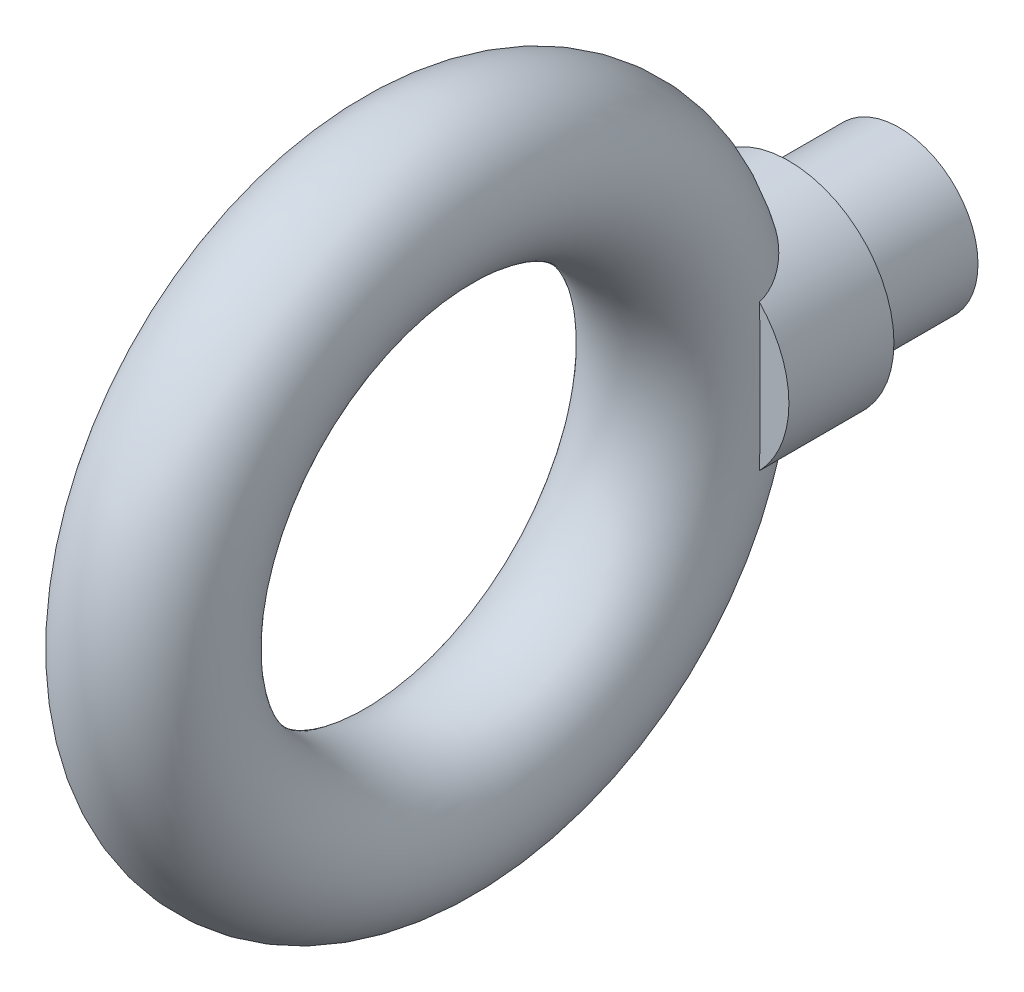
ISO-10303-21;
HEADER;
FILE_DESCRIPTION(('STEP AP214'),'2;1');
FILE_NAME('part.step','',(''),(''),'','','');
FILE_SCHEMA(('AUTOMOTIVE_DESIGN { 1 0 10303 214 1 1 1 1 }'));
ENDSEC;
DATA;
#1=APPLICATION_CONTEXT('core data for automotive mechanical design processes');
#2=APPLICATION_PROTOCOL_DEFINITION('international standard','automotive_design',2000,#1);
#3=PRODUCT_CONTEXT('',#1,'mechanical');
#4=PRODUCT('Part','Part','',(#3));
#5=PRODUCT_RELATED_PRODUCT_CATEGORY('part','',(#4));
#6=PRODUCT_DEFINITION_FORMATION('','',#4);
#7=PRODUCT_DEFINITION_CONTEXT('part definition',#1,'design');
#8=PRODUCT_DEFINITION('design','',#6,#7);
#9=PRODUCT_DEFINITION_SHAPE('','',#8);
#10=(LENGTH_UNIT() NAMED_UNIT(*) SI_UNIT(.MILLI.,.METRE.));
#11=(NAMED_UNIT(*) PLANE_ANGLE_UNIT() SI_UNIT($,.RADIAN.));
#12=(NAMED_UNIT(*) SI_UNIT($,.STERADIAN.) SOLID_ANGLE_UNIT());
#13=UNCERTAINTY_MEASURE_WITH_UNIT(LENGTH_MEASURE(1.E-05),#10,'distance_accuracy_value','');
#14=(GEOMETRIC_REPRESENTATION_CONTEXT(3) GLOBAL_UNCERTAINTY_ASSIGNED_CONTEXT((#13)) GLOBAL_UNIT_ASSIGNED_CONTEXT((#10,
#11,#12)) REPRESENTATION_CONTEXT('',''));
#15=CARTESIAN_POINT('',(0.,0.,0.));
#16=DIRECTION('',(0.,0.,1.));
#17=DIRECTION('',(1.,0.,0.));
#18=AXIS2_PLACEMENT_3D('',#15,#16,#17);
#19=CARTESIAN_POINT('',(0.,0.,8.2));
#20=DIRECTION('',(0.,0.,-1.));
#21=DIRECTION('',(-1.,0.,0.));
#22=AXIS2_PLACEMENT_3D('',#19,#20,#21);
#23=CYLINDRICAL_SURFACE('',#22,3.);
#24=CARTESIAN_POINT('',(0.,0.,0.));
#25=DIRECTION('',(0.,0.,1.));
#26=DIRECTION('',(1.,0.,0.));
#27=AXIS2_PLACEMENT_3D('',#24,#25,#26);
#28=CIRCLE('',#27,3.);
#29=CARTESIAN_POINT('',(3.,0.,0.));
#30=VERTEX_POINT('',#29);
#31=EDGE_CURVE('E66',#30,#30,#28,.T.);
#32=ORIENTED_EDGE('',*,*,#31,.T.);
#33=EDGE_LOOP('',(#32));
#34=FACE_BOUND('',#33,.T.);
#35=CARTESIAN_POINT('',(0.,0.,4.2));
#36=DIRECTION('',(0.,0.,1.));
#37=DIRECTION('',(1.,0.,0.));
#38=AXIS2_PLACEMENT_3D('',#35,#36,#37);
#39=CIRCLE('',#38,3.);
#40=CARTESIAN_POINT('',(3.,0.,4.2));
#41=VERTEX_POINT('',#40);
#42=EDGE_CURVE('E11',#41,#41,#39,.T.);
#43=ORIENTED_EDGE('',*,*,#42,.F.);
#44=EDGE_LOOP('',(#43));
#45=FACE_BOUND('',#44,.T.);
#46=ADVANCED_FACE('F36',(#34,#45),#23,.T.);
#47=CARTESIAN_POINT('',(0.,0.,0.));
#48=DIRECTION('',(0.,0.,1.));
#49=DIRECTION('',(1.,0.,0.));
#50=AXIS2_PLACEMENT_3D('',#47,#48,#49);
#51=PLANE('',#50);
#52=ORIENTED_EDGE('',*,*,#31,.F.);
#53=EDGE_LOOP('',(#52));
#54=FACE_BOUND('',#53,.T.);
#55=ADVANCED_FACE('F104',(#54),#51,.F.);
#56=CARTESIAN_POINT('',(0.,0.,4.2));
#57=DIRECTION('',(0.,0.,1.));
#58=DIRECTION('',(1.,0.,0.));
#59=AXIS2_PLACEMENT_3D('',#56,#57,#58);
#60=PLANE('',#59);
#61=CARTESIAN_POINT('',(0.,0.,4.2));
#62=DIRECTION('',(0.,0.,1.));
#63=DIRECTION('',(1.,0.,0.));
#64=AXIS2_PLACEMENT_3D('',#61,#62,#63);
#65=CIRCLE('',#64,4.);
#66=CARTESIAN_POINT('',(4.,0.,4.2));
#67=VERTEX_POINT('',#66);
#68=EDGE_CURVE('E75',#67,#67,#65,.T.);
#69=ORIENTED_EDGE('',*,*,#68,.F.);
#70=EDGE_LOOP('',(#69));
#71=FACE_BOUND('',#70,.T.);
#72=ORIENTED_EDGE('',*,*,#42,.T.);
#73=EDGE_LOOP('',(#72));
#74=FACE_BOUND('',#73,.T.);
#75=ADVANCED_FACE('F100',(#71,#74),#60,.F.);
#76=CARTESIAN_POINT('',(0.,0.,4.2));
#77=DIRECTION('',(0.,0.,1.));
#78=DIRECTION('',(1.,0.,0.));
#79=AXIS2_PLACEMENT_3D('',#76,#77,#78);
#80=CYLINDRICAL_SURFACE('',#79,4.);
#81=ORIENTED_EDGE('',*,*,#68,.T.);
#82=EDGE_LOOP('',(#81));
#83=FACE_BOUND('',#82,.T.);
#84=CARTESIAN_POINT('',(2.87558129313584,2.78047338174045,8.20020000000001));
#85=CARTESIAN_POINT('',(2.8668163331566,2.78951972189364,8.13290860941364));
#86=CARTESIAN_POINT('',(2.8556063579357,2.8010460765121,8.06630078863233));
#87=CARTESIAN_POINT('',(2.82842675937782,2.82849808273465,7.93509479380524));
#88=CARTESIAN_POINT('',(2.81246435956833,2.84441705503725,7.87049373295381));
#89=CARTESIAN_POINT('',(2.77605947415572,2.87995204819738,7.74434807725299));
#90=CARTESIAN_POINT('',(2.75566167117051,2.89953094078722,7.68278001718187));
#91=CARTESIAN_POINT('',(2.71050143019162,2.94179262248841,7.56237139912809));
#92=CARTESIAN_POINT('',(2.68573751491093,2.96447646158476,7.50353177285676));
#93=CARTESIAN_POINT('',(2.6055241740768,3.0358384568672,7.33211997232601));
#94=CARTESIAN_POINT('',(2.54391559930227,3.08807179719291,7.22384452475566));
#95=CARTESIAN_POINT('',(2.40577757786088,3.19687351620991,7.01944232342703));
#96=CARTESIAN_POINT('',(2.32920706513163,3.25345355987673,6.92335023421617));
#97=CARTESIAN_POINT('',(2.15114340221079,3.37426419820854,6.731369281726));
#98=CARTESIAN_POINT('',(2.04767492476977,3.4384847472684,6.63729901922333));
#99=CARTESIAN_POINT('',(1.82512446378997,3.56161702993713,6.46568214038757));
#100=CARTESIAN_POINT('',(1.7060440591267,3.62052929937116,6.38813385522229));
#101=CARTESIAN_POINT('',(1.44085407485933,3.7345530657047,6.24287429039681));
#102=CARTESIAN_POINT('',(1.29321690947494,3.78859526738382,6.17708428315477));
#103=CARTESIAN_POINT('',(0.985047984966199,3.88014055303585,6.06791934780051));
#104=CARTESIAN_POINT('',(0.824519711095935,3.91764808966092,6.02453838457197));
#105=CARTESIAN_POINT('',(0.505300401221189,3.97105742028187,5.9633054298052));
#106=CARTESIAN_POINT('',(0.347062909683602,3.98810653898653,5.94409449620717));
#107=CARTESIAN_POINT('',(0.0285683994185187,4.00306991623282,5.9272162880416));
#108=CARTESIAN_POINT('',(-0.131687873094603,4.00099104925576,5.92954127359816));
#109=CARTESIAN_POINT('',(-0.439569995074033,3.97859226174756,5.95485659673338));
#110=CARTESIAN_POINT('',(-0.587380756896093,3.95936288581058,5.97661155899829));
#111=CARTESIAN_POINT('',(-0.876180449814498,3.90562208521733,6.03849067206565));
#112=CARTESIAN_POINT('',(-1.01716956039897,3.87111106288748,6.07861433926831));
#113=CARTESIAN_POINT('',(-1.2919261620332,3.78839850475261,6.17740084298226));
#114=CARTESIAN_POINT('',(-1.42546928374572,3.73991497660207,6.23644868257861));
#115=CARTESIAN_POINT('',(-1.67923126303157,3.63306505491525,6.37183999308199));
#116=CARTESIAN_POINT('',(-1.79944044966835,3.57469156486929,6.44819589672201));
#117=CARTESIAN_POINT('',(-2.03313154020781,3.44752244393446,6.62405865321118));
#118=CARTESIAN_POINT('',(-2.14535578410649,3.37826894906249,6.72490742691012));
#119=CARTESIAN_POINT('',(-2.3495039764539,3.23960349921638,6.94545882215044));
#120=CARTESIAN_POINT('',(-2.44143148475907,3.17019157419052,7.06515813116559));
#121=CARTESIAN_POINT('',(-2.5852179973545,3.05341384380939,7.29546935832888));
#122=CARTESIAN_POINT('',(-2.64144120151746,3.00450366070358,7.40257348834003));
#123=CARTESIAN_POINT('',(-2.73808766823659,2.91670137098883,7.62727687025745));
#124=CARTESIAN_POINT('',(-2.77856547527022,2.877774842079,7.74483812580717));
#125=CARTESIAN_POINT('',(-2.82476422528207,2.83215623570087,7.92062328765685));
#126=CARTESIAN_POINT('',(-2.83731387696423,2.8195570168698,7.97561543212798));
#127=CARTESIAN_POINT('',(-2.85901442368801,2.79754578222294,8.0869716867883));
#128=CARTESIAN_POINT('',(-2.86816068203087,2.78813811602798,8.14333755799561));
#129=CARTESIAN_POINT('',(-2.87558129313584,2.78047338174045,8.20020000000001));
#130=B_SPLINE_CURVE_WITH_KNOTS('',3,(#84,#85,#86,#87,#88,#89,#90,#91,#92,#93,#94,#95,#96,#97,
#98,#99,#100,#101,#102,#103,#104,#105,#106,#107,#108,#109,#110,#111,#112,#113,#114,#115,#116,
#117,#118,#119,#120,#121,#122,#123,#124,#125,#126,#127,#128,#129),.UNSPECIFIED.,.F.,.F.,(4,2,2,
2,2,2,2,2,2,2,2,2,2,2,2,2,2,2,2,2,2,2,4),(0.,0.205244577061091,0.410178768150286,
0.613136913757913,0.816163863103949,1.21961422378472,1.62418789715012,2.08399274185607,
2.54375112110058,3.05237006350768,3.56085195513602,4.03924015646524,4.51745643471201,
4.96727465815681,5.41708103974944,5.87669099203243,6.33663214358663,6.83247720403733,
7.32823522872371,7.71824591357166,8.1068932465595,8.28010276306779,8.45354739938682),.UNSPECIFIED.);
#131=CARTESIAN_POINT('',(2.87555516689132,2.78050040139624,8.2));
#132=VERTEX_POINT('',#131);
#133=CARTESIAN_POINT('',(-2.8755551669009,2.78050040138633,8.2));
#134=VERTEX_POINT('',#133);
#135=EDGE_CURVE('E43',#132,#134,#130,.T.);
#136=ORIENTED_EDGE('',*,*,#135,.F.);
#137=CARTESIAN_POINT('',(0.,0.,8.2));
#138=DIRECTION('',(0.,0.,1.));
#139=DIRECTION('',(1.,0.,0.));
#140=AXIS2_PLACEMENT_3D('',#137,#138,#139);
#141=CIRCLE('',#140,4.);
#142=CARTESIAN_POINT('',(2.87555516690089,-2.78050040138634,8.2));
#143=VERTEX_POINT('',#142);
#144=EDGE_CURVE('E71',#143,#132,#141,.T.);
#145=ORIENTED_EDGE('',*,*,#144,.F.);
#146=CARTESIAN_POINT('',(-2.87558129313584,-2.78047338174045,8.20020000000001));
#147=CARTESIAN_POINT('',(-2.8668163331566,-2.78951972189364,8.13290860941364));
#148=CARTESIAN_POINT('',(-2.8556063579357,-2.8010460765121,8.06630078863233));
#149=CARTESIAN_POINT('',(-2.82842675937782,-2.82849808273465,7.93509479380524));
#150=CARTESIAN_POINT('',(-2.81246435956833,-2.84441705503725,7.87049373295381));
#151=CARTESIAN_POINT('',(-2.77605947415572,-2.87995204819738,7.74434807725299));
#152=CARTESIAN_POINT('',(-2.75566167117051,-2.89953094078722,7.68278001718187));
#153=CARTESIAN_POINT('',(-2.71050143019162,-2.94179262248841,7.56237139912809));
#154=CARTESIAN_POINT('',(-2.68573751491093,-2.96447646158476,7.50353177285676));
#155=CARTESIAN_POINT('',(-2.6055241740768,-3.0358384568672,7.33211997232601));
#156=CARTESIAN_POINT('',(-2.54391559930227,-3.08807179719291,7.22384452475566));
#157=CARTESIAN_POINT('',(-2.40577757786088,-3.19687351620991,7.01944232342703));
#158=CARTESIAN_POINT('',(-2.32920706513163,-3.25345355987673,6.92335023421617));
#159=CARTESIAN_POINT('',(-2.15114340221079,-3.37426419820854,6.731369281726));
#160=CARTESIAN_POINT('',(-2.04767492476977,-3.4384847472684,6.63729901922333));
#161=CARTESIAN_POINT('',(-1.82512446378997,-3.56161702993713,6.46568214038757));
#162=CARTESIAN_POINT('',(-1.7060440591267,-3.62052929937116,6.38813385522229));
#163=CARTESIAN_POINT('',(-1.44085407485933,-3.7345530657047,6.24287429039681));
#164=CARTESIAN_POINT('',(-1.29321690947494,-3.78859526738382,6.17708428315477));
#165=CARTESIAN_POINT('',(-0.985047984966199,-3.88014055303585,6.06791934780051));
#166=CARTESIAN_POINT('',(-0.824519711095935,-3.91764808966092,6.02453838457197));
#167=CARTESIAN_POINT('',(-0.505300401221189,-3.97105742028187,5.9633054298052));
#168=CARTESIAN_POINT('',(-0.347062909683602,-3.98810653898653,5.94409449620717));
#169=CARTESIAN_POINT('',(-0.0285683994185187,-4.00306991623282,5.9272162880416));
#170=CARTESIAN_POINT('',(0.131687873094603,-4.00099104925576,5.92954127359816));
#171=CARTESIAN_POINT('',(0.439569995074033,-3.97859226174756,5.95485659673338));
#172=CARTESIAN_POINT('',(0.587380756896093,-3.95936288581058,5.97661155899829));
#173=CARTESIAN_POINT('',(0.876180449814498,-3.90562208521733,6.03849067206565));
#174=CARTESIAN_POINT('',(1.01716956039897,-3.87111106288748,6.07861433926831));
#175=CARTESIAN_POINT('',(1.2919261620332,-3.78839850475261,6.17740084298226));
#176=CARTESIAN_POINT('',(1.42546928374572,-3.73991497660207,6.23644868257861));
#177=CARTESIAN_POINT('',(1.67923126303157,-3.63306505491525,6.37183999308199));
#178=CARTESIAN_POINT('',(1.79944044966835,-3.57469156486929,6.44819589672201));
#179=CARTESIAN_POINT('',(2.03313154020781,-3.44752244393446,6.62405865321118));
#180=CARTESIAN_POINT('',(2.14535578410649,-3.37826894906249,6.72490742691012));
#181=CARTESIAN_POINT('',(2.3495039764539,-3.23960349921638,6.94545882215044));
#182=CARTESIAN_POINT('',(2.44143148475907,-3.17019157419052,7.06515813116559));
#183=CARTESIAN_POINT('',(2.5852179973545,-3.05341384380939,7.29546935832888));
#184=CARTESIAN_POINT('',(2.64144120151746,-3.00450366070358,7.40257348834003));
#185=CARTESIAN_POINT('',(2.73808766823659,-2.91670137098883,7.62727687025745));
#186=CARTESIAN_POINT('',(2.77856547527022,-2.877774842079,7.74483812580717));
#187=CARTESIAN_POINT('',(2.82476422528207,-2.83215623570087,7.92062328765685));
#188=CARTESIAN_POINT('',(2.83731387696423,-2.8195570168698,7.97561543212798));
#189=CARTESIAN_POINT('',(2.85901442368801,-2.79754578222294,8.0869716867883));
#190=CARTESIAN_POINT('',(2.86816068203087,-2.78813811602798,8.14333755799561));
#191=CARTESIAN_POINT('',(2.87558129313584,-2.78047338174045,8.20020000000001));
#192=B_SPLINE_CURVE_WITH_KNOTS('',3,(#146,#147,#148,#149,#150,#151,#152,#153,#154,#155,#156,
#157,#158,#159,#160,#161,#162,#163,#164,#165,#166,#167,#168,#169,#170,#171,#172,#173,#174,#175,
#176,#177,#178,#179,#180,#181,#182,#183,#184,#185,#186,#187,#188,#189,#190,#191),.UNSPECIFIED.,
.F.,.F.,(4,2,2,2,2,2,2,2,2,2,2,2,2,2,2,2,2,2,2,2,2,2,4),(0.,0.205244577061091,0.410178768150286,
0.613136913757913,0.816163863103949,1.21961422378472,1.62418789715012,2.08399274185607,
2.54375112110058,3.05237006350768,3.56085195513602,4.03924015646524,4.51745643471201,
4.96727465815681,5.41708103974944,5.87669099203243,6.33663214358663,6.83247720403733,
7.32823522872371,7.71824591357166,8.1068932465595,8.28010276306779,8.45354739938682),.UNSPECIFIED.);
#193=CARTESIAN_POINT('',(-2.87555516690089,-2.78050040138634,8.2));
#194=VERTEX_POINT('',#193);
#195=EDGE_CURVE('E65',#194,#143,#192,.T.);
#196=ORIENTED_EDGE('',*,*,#195,.F.);
#197=EDGE_CURVE('E72',#134,#194,#141,.T.);
#198=ORIENTED_EDGE('',*,*,#197,.F.);
#199=EDGE_LOOP('',(#136,#145,#196,#198));
#200=FACE_BOUND('',#199,.T.);
#201=ADVANCED_FACE('F70',(#83,#200),#80,.T.);
#202=CARTESIAN_POINT('',(0.,0.,18.3));
#203=DIRECTION('',(-1.,0.,0.));
#204=DIRECTION('',(0.,0.,1.));
#205=AXIS2_PLACEMENT_3D('',#202,#203,#204);
#206=TOROIDAL_SURFACE('',#205,10.1,2.9);
#207=CARTESIAN_POINT('',(0.,-8.18474190185616,8.2));
#208=CARTESIAN_POINT('',(-0.118061997504569,-8.18474311299206,8.2));
#209=CARTESIAN_POINT('',(-0.236119461922598,-8.17320186075728,8.2));
#210=CARTESIAN_POINT('',(-0.467916799585644,-8.12807532907063,8.2));
#211=CARTESIAN_POINT('',(-0.581654910340517,-8.09448115113587,8.2));
#212=CARTESIAN_POINT('',(-0.800626872464949,-8.00823623580762,8.2));
#213=CARTESIAN_POINT('',(-0.905913923068862,-7.95571840492192,8.2));
#214=CARTESIAN_POINT('',(-1.10696012825634,-7.83493701216883,8.2));
#215=CARTESIAN_POINT('',(-1.20271292075992,-7.76666303590637,8.2));
#216=CARTESIAN_POINT('',(-1.42161456111322,-7.58664178891363,8.2));
#217=CARTESIAN_POINT('',(-1.53958970585648,-7.46862481496877,8.2));
#218=CARTESIAN_POINT('',(-1.75530246722392,-7.21544865245797,8.2));
#219=CARTESIAN_POINT('',(-1.8530041243899,-7.08025967862686,8.2));
#220=CARTESIAN_POINT('',(-2.01139794396179,-6.82816163183633,8.2));
#221=CARTESIAN_POINT('',(-2.07555312013371,-6.71337883163367,8.2));
#222=CARTESIAN_POINT('',(-2.19361846409708,-6.47859468536324,8.2));
#223=CARTESIAN_POINT('',(-2.24752114803525,-6.35858960518726,8.2));
#224=CARTESIAN_POINT('',(-2.3462918778904,-6.11470260197299,8.2));
#225=CARTESIAN_POINT('',(-2.39114301316591,-5.99081391300252,8.2));
#226=CARTESIAN_POINT('',(-2.47278354127803,-5.74053727713979,8.2));
#227=CARTESIAN_POINT('',(-2.5095784950814,-5.61415112030135,8.2));
#228=CARTESIAN_POINT('',(-2.60805023212174,-5.23795224888277,8.2));
#229=CARTESIAN_POINT('',(-2.6599170432004,-4.98557141455972,8.2));
#230=CARTESIAN_POINT('',(-2.74395018114848,-4.47747388213927,8.2));
#231=CARTESIAN_POINT('',(-2.77609148484711,-4.22175336544821,8.2));
#232=CARTESIAN_POINT('',(-2.82641536622409,-3.70779456295545,8.2));
#233=CARTESIAN_POINT('',(-2.84453112336925,-3.44955008879251,8.2));
#234=CARTESIAN_POINT('',(-2.87134112601269,-2.93274270567563,8.2));
#235=CARTESIAN_POINT('',(-2.88003942738489,-2.67417998185643,8.2));
#236=CARTESIAN_POINT('',(-2.89197416267217,-2.15437715372501,8.2));
#237=CARTESIAN_POINT('',(-2.89515539311095,-1.89313600640587,8.2));
#238=CARTESIAN_POINT('',(-2.89892544129154,-1.37062539939716,8.2));
#239=CARTESIAN_POINT('',(-2.89951407812725,-1.10935593900397,8.2));
#240=CARTESIAN_POINT('',(-2.90004956603792,-0.587494328683252,8.2));
#241=CARTESIAN_POINT('',(-2.89999807653475,-0.326902178356442,8.2));
#242=CARTESIAN_POINT('',(-2.90000190707725,0.194275416534802,8.2));
#243=CARTESIAN_POINT('',(-2.90005722434925,0.45486086109764,8.2));
#244=CARTESIAN_POINT('',(-2.89978055663209,0.884878734213847,8.2));
#245=CARTESIAN_POINT('',(-2.89957728160226,1.0543111764586,8.2));
#246=CARTESIAN_POINT('',(-2.8985409766605,1.39317456148492,8.2));
#247=CARTESIAN_POINT('',(-2.8977079475465,1.56260550426811,8.2));
#248=CARTESIAN_POINT('',(-2.89479004410906,1.90163983176876,8.2));
#249=CARTESIAN_POINT('',(-2.8927038300321,2.0712432068299,8.2));
#250=CARTESIAN_POINT('',(-2.88645992674252,2.4104179822512,8.2));
#251=CARTESIAN_POINT('',(-2.88230220734417,2.57998938210938,8.2));
#252=CARTESIAN_POINT('',(-2.87094398321555,2.91840362232436,8.2));
#253=CARTESIAN_POINT('',(-2.86375488268858,3.08724682154201,8.2));
#254=CARTESIAN_POINT('',(-2.84518878217455,3.42470011596959,8.2));
#255=CARTESIAN_POINT('',(-2.83381210112831,3.59331022795083,8.2));
#256=CARTESIAN_POINT('',(-2.80557559343661,3.92988101244743,8.2));
#257=CARTESIAN_POINT('',(-2.78872240909883,4.09784222352975,8.2));
#258=CARTESIAN_POINT('',(-2.74804406335506,4.43297007212052,8.2));
#259=CARTESIAN_POINT('',(-2.72421769062564,4.60013656644599,8.2));
#260=CARTESIAN_POINT('',(-2.66744031831586,4.93587992847257,8.2));
#261=CARTESIAN_POINT('',(-2.63434067241443,5.10443224844734,8.2));
#262=CARTESIAN_POINT('',(-2.55722894525026,5.43898450004031,8.2));
#263=CARTESIAN_POINT('',(-2.51322244215839,5.60498569045373,8.2));
#264=CARTESIAN_POINT('',(-2.4122345845232,5.93239924468001,8.2));
#265=CARTESIAN_POINT('',(-2.35530153579275,6.0938262378005,8.2));
#266=CARTESIAN_POINT('',(-2.2259807644963,6.41026912426581,8.2));
#267=CARTESIAN_POINT('',(-2.1536122863927,6.56529271651511,8.2));
#268=CARTESIAN_POINT('',(-1.99974309667727,6.84912763425507,8.2));
#269=CARTESIAN_POINT('',(-1.92012572782877,6.97894553278222,8.2));
#270=CARTESIAN_POINT('',(-1.74475138600082,7.22749952732128,8.2));
#271=CARTESIAN_POINT('',(-1.6489816873262,7.34622677000033,8.2));
#272=CARTESIAN_POINT('',(-1.43868330765264,7.56896770826317,8.2));
#273=CARTESIAN_POINT('',(-1.3239442458432,7.67278874268638,8.2));
#274=CARTESIAN_POINT('',(-1.13891023156668,7.81086325215485,8.2));
#275=CARTESIAN_POINT('',(-1.07511733330777,7.85392606195303,8.2));
#276=CARTESIAN_POINT('',(-0.943474243249609,7.93328819390883,8.2));
#277=CARTESIAN_POINT('',(-0.875626057438643,7.96959082407413,8.2));
#278=CARTESIAN_POINT('',(-0.70857464011809,8.04740428874403,8.2));
#279=CARTESIAN_POINT('',(-0.607622487485211,8.08525534302229,8.2));
#280=CARTESIAN_POINT('',(-0.400835068477141,8.14354352317564,8.2));
#281=CARTESIAN_POINT('',(-0.295003036592999,8.16399201380007,8.2));
#282=CARTESIAN_POINT('',(-0.0810490577929093,8.18610130135482,8.2));
#283=CARTESIAN_POINT('',(0.0270786402580714,8.18770743716435,8.2));
#284=CARTESIAN_POINT('',(0.241920483717712,8.17186130877001,8.2));
#285=CARTESIAN_POINT('',(0.348634464265101,8.15440684126597,8.2));
#286=CARTESIAN_POINT('',(0.553372510873556,8.10276034330211,8.2));
#287=CARTESIAN_POINT('',(0.65157334056294,8.06925757016966,8.2));
#288=CARTESIAN_POINT('',(0.841749841152999,7.98783495414706,8.2));
#289=CARTESIAN_POINT('',(0.93372329445266,7.93991000818003,8.2));
#290=CARTESIAN_POINT('',(1.14467771491743,7.81082060500795,8.2));
#291=CARTESIAN_POINT('',(1.26018929153154,7.72398334454091,8.2));
#292=CARTESIAN_POINT('',(1.47565629657922,7.53279397630257,8.2));
#293=CARTESIAN_POINT('',(1.5755788956229,7.42840584238061,8.2));
#294=CARTESIAN_POINT('',(1.8034297804721,7.1553703753693,8.2));
#295=CARTESIAN_POINT('',(1.92263253842945,6.97948609148364,8.2));
#296=CARTESIAN_POINT('',(2.13260645345565,6.61173564919376,8.2));
#297=CARTESIAN_POINT('',(2.2233279411914,6.41984230145214,8.2));
#298=CARTESIAN_POINT('',(2.37361086068058,6.04577679088935,8.2));
#299=CARTESIAN_POINT('',(2.43533231858985,5.86444930327077,8.2));
#300=CARTESIAN_POINT('',(2.54299369991388,5.49709080354977,8.2));
#301=CARTESIAN_POINT('',(2.58891907703858,5.31105562454365,8.2));
#302=CARTESIAN_POINT('',(2.66804181044211,4.9358812521502,8.2));
#303=CARTESIAN_POINT('',(2.7012068080185,4.74673541930736,8.2));
#304=CARTESIAN_POINT('',(2.75731786947941,4.36690690768592,8.2));
#305=CARTESIAN_POINT('',(2.78026010866884,4.17622368083252,8.2));
#306=CARTESIAN_POINT('',(2.81551623965541,3.82136963408711,8.2));
#307=CARTESIAN_POINT('',(2.82887963372395,3.65729854488986,8.2));
#308=CARTESIAN_POINT('',(2.85106908024794,3.32884314034181,8.2));
#309=CARTESIAN_POINT('',(2.85989470465576,3.1644587969092,8.2));
#310=CARTESIAN_POINT('',(2.87414407328362,2.83547607866244,8.2));
#311=CARTESIAN_POINT('',(2.87956627472631,2.67087764062685,8.2));
#312=CARTESIAN_POINT('',(2.88798908296802,2.34162840772148,8.2));
#313=CARTESIAN_POINT('',(2.89098976774737,2.17697761470854,8.2));
#314=CARTESIAN_POINT('',(2.89540139678249,1.84793876161945,8.2));
#315=CARTESIAN_POINT('',(2.89681505045996,1.68355073367587,8.2));
#316=CARTESIAN_POINT('',(2.89873238068928,1.35477295957142,8.2));
#317=CARTESIAN_POINT('',(2.899236071285,1.19038321347621,8.2));
#318=CARTESIAN_POINT('',(2.89983214492201,0.86164489886065,8.2));
#319=CARTESIAN_POINT('',(2.89992463199532,0.697296330445139,8.2));
#320=CARTESIAN_POINT('',(2.90000728535879,0.36859921174235,8.2));
#321=CARTESIAN_POINT('',(2.8999974516558,0.204250661455071,8.2));
#322=CARTESIAN_POINT('',(2.90000351173173,-0.186741840579466,8.2));
#323=CARTESIAN_POINT('',(2.90003057022566,-0.413385787838417,8.2));
#324=CARTESIAN_POINT('',(2.89982790452714,-0.866673272582677,8.2));
#325=CARTESIAN_POINT('',(2.89959818087941,-1.09331681006784,8.2));
#326=CARTESIAN_POINT('',(2.89785576536418,-1.54708428316533,8.2));
#327=CARTESIAN_POINT('',(2.89634034164548,-1.77420821370185,8.2));
#328=CARTESIAN_POINT('',(2.89034737551664,-2.2284121668209,8.2));
#329=CARTESIAN_POINT('',(2.88587000228408,-2.45549219117028,8.2));
#330=CARTESIAN_POINT('',(2.87142467391191,-2.91817241888444,8.2));
#331=CARTESIAN_POINT('',(2.86125371617236,-3.15376707840055,8.2));
#332=CARTESIAN_POINT('',(2.83213747690476,-3.6245304943349,8.2));
#333=CARTESIAN_POINT('',(2.81318952330668,-3.85969909914128,8.2));
#334=CARTESIAN_POINT('',(2.76282623685533,-4.32791241755197,8.2));
#335=CARTESIAN_POINT('',(2.73145587201564,-4.56096172387016,8.2));
#336=CARTESIAN_POINT('',(2.65183615052063,-5.02409663242327,8.2));
#337=CARTESIAN_POINT('',(2.60360167647295,-5.25418466296842,8.2));
#338=CARTESIAN_POINT('',(2.49095450524367,-5.68597032001311,8.2));
#339=CARTESIAN_POINT('',(2.42864421225325,-5.88820457815141,8.2));
#340=CARTESIAN_POINT('',(2.28144998261645,-6.28512046699049,8.2));
#341=CARTESIAN_POINT('',(2.19651942708427,-6.47978553762109,8.2));
#342=CARTESIAN_POINT('',(2.0478622781396,-6.76248898936247,8.2));
#343=CARTESIAN_POINT('',(1.99427096607009,-6.85585403848696,8.2));
#344=CARTESIAN_POINT('',(1.87943057367613,-7.03772835219003,8.2));
#345=CARTESIAN_POINT('',(1.81817949983662,-7.1262363440205,8.2));
#346=CARTESIAN_POINT('',(1.62242630692845,-7.38171612082874,8.2));
#347=CARTESIAN_POINT('',(1.47535675358864,-7.53978386427856,8.2));
#348=CARTESIAN_POINT('',(1.21963312629603,-7.75402039439537,8.2));
#349=CARTESIAN_POINT('',(1.1227355496659,-7.82434610318009,8.2));
#350=CARTESIAN_POINT('',(0.918949485206259,-7.9488511133039,8.2));
#351=CARTESIAN_POINT('',(0.812066505410038,-8.00303924798614,8.2));
#352=CARTESIAN_POINT('',(0.58992605088676,-8.0918585495034,8.2));
#353=CARTESIAN_POINT('',(0.474641595092154,-8.12642326453438,8.2));
#354=CARTESIAN_POINT('',(0.239568241367928,-8.17285825728754,8.2));
#355=CARTESIAN_POINT('',(0.119781787627007,-8.18474067307784,8.2));
#356=CARTESIAN_POINT('',(0.,-8.18474190185616,8.2));
#357=B_SPLINE_CURVE_WITH_KNOTS('',3,(#207,#208,#209,#210,#211,#212,#213,#214,#215,#216,#217,
#218,#219,#220,#221,#222,#223,#224,#225,#226,#227,#228,#229,#230,#231,#232,#233,#234,#235,#236,
#237,#238,#239,#240,#241,#242,#243,#244,#245,#246,#247,#248,#249,#250,#251,#252,#253,#254,#255,
#256,#257,#258,#259,#260,#261,#262,#263,#264,#265,#266,#267,#268,#269,#270,#271,#272,#273,#274,
#275,#276,#277,#278,#279,#280,#281,#282,#283,#284,#285,#286,#287,#288,#289,#290,#291,#292,#293,
#294,#295,#296,#297,#298,#299,#300,#301,#302,#303,#304,#305,#306,#307,#308,#309,#310,#311,#312,
#313,#314,#315,#316,#317,#318,#319,#320,#321,#322,#323,#324,#325,#326,#327,#328,#329,#330,#331,
#332,#333,#334,#335,#336,#337,#338,#339,#340,#341,#342,#343,#344,#345,#346,#347,#348,#349,#350,
#351,#352,#353,#354,#355,#356),.UNSPECIFIED.,.T.,.F.,(4,2,2,2,2,2,2,2,2,2,2,2,2,2,2,2,2,2,2,2,2,
2,2,2,2,2,2,2,2,2,2,2,2,2,2,2,2,2,2,2,2,2,2,2,2,2,2,2,2,2,2,2,2,2,2,2,2,2,2,2,2,2,2,2,2,2,2,2,2,
2,2,2,2,2,4),(0.,0.353642504045119,0.707427792668216,1.05877528266795,1.4103556725869,
1.90819260925502,2.40690515965697,2.80084639901968,3.19507410317876,3.59003164427979,
3.984715691168,4.75644644166371,5.52915417324648,6.30552096578863,7.08155326247446,
7.86530663176356,8.64911468896195,9.43089127776386,10.2126475647855,10.7209449375244,
11.229241666233,11.7380827737554,12.2469312962687,12.7538823488191,13.2607947981886,
13.7670947072538,14.2734826187217,14.7885043112349,15.3032631441516,15.8161291197455,
16.3283593675606,16.784180142894,17.2403617310155,17.701991562851,17.9325483444774,
18.1629920079024,18.4849785373391,18.8067546316696,19.1294639590017,19.4522105936938,
19.7621928770374,20.0722849723429,20.5034041492529,20.935419324224,21.5692660102008,
22.2042120175776,22.7779832243132,23.3522813994651,23.9280264712359,24.5039867690842,
24.9977551938329,25.4915701871954,25.9856088663708,26.479631635336,26.9728097067756,
27.4659801666999,27.959025850353,28.4520715009709,29.1320033913996,29.8119338394824,
30.4933126301783,31.1746525059439,31.8819925602511,32.5895480989523,33.2945654265868,
33.9989621390685,34.6328581708112,35.2680708679625,35.5906672642198,35.9133477942176,
36.5549361261658,36.9129140974553,37.2706957580084,37.6296818750799,37.9884758325832),.UNSPECIFIED.);
#358=EDGE_CURVE('E57',#132,#143,#357,.T.);
#359=ORIENTED_EDGE('',*,*,#358,.F.);
#360=ORIENTED_EDGE('',*,*,#135,.T.);
#361=EDGE_CURVE('E50',#194,#134,#357,.T.);
#362=ORIENTED_EDGE('',*,*,#361,.F.);
#363=ORIENTED_EDGE('',*,*,#195,.T.);
#364=EDGE_LOOP('',(#359,#360,#362,#363));
#365=FACE_BOUND('',#364,.T.);
#366=ADVANCED_FACE('F63',(#365),#206,.T.);
#367=CARTESIAN_POINT('',(0.,0.,8.2));
#368=DIRECTION('',(0.,0.,1.));
#369=DIRECTION('',(1.,0.,0.));
#370=AXIS2_PLACEMENT_3D('',#367,#368,#369);
#371=PLANE('',#370);
#372=ORIENTED_EDGE('',*,*,#358,.T.);
#373=ORIENTED_EDGE('',*,*,#144,.T.);
#374=EDGE_LOOP('',(#372,#373));
#375=FACE_BOUND('',#374,.T.);
#376=ADVANCED_FACE('F73',(#375),#371,.T.);
#377=ORIENTED_EDGE('',*,*,#361,.T.);
#378=ORIENTED_EDGE('',*,*,#197,.T.);
#379=EDGE_LOOP('',(#377,#378));
#380=FACE_BOUND('',#379,.T.);
#381=ADVANCED_FACE('F88',(#380),#371,.T.);
#382=CLOSED_SHELL('',(#46,#55,#75,#201,#366,#376,#381));
#383=MANIFOLD_SOLID_BREP('B2',#382);
#384=ADVANCED_BREP_SHAPE_REPRESENTATION('',(#18,#383),#14);
#385=SHAPE_DEFINITION_REPRESENTATION(#9,#384);
ENDSEC;
END-ISO-10303-21;
